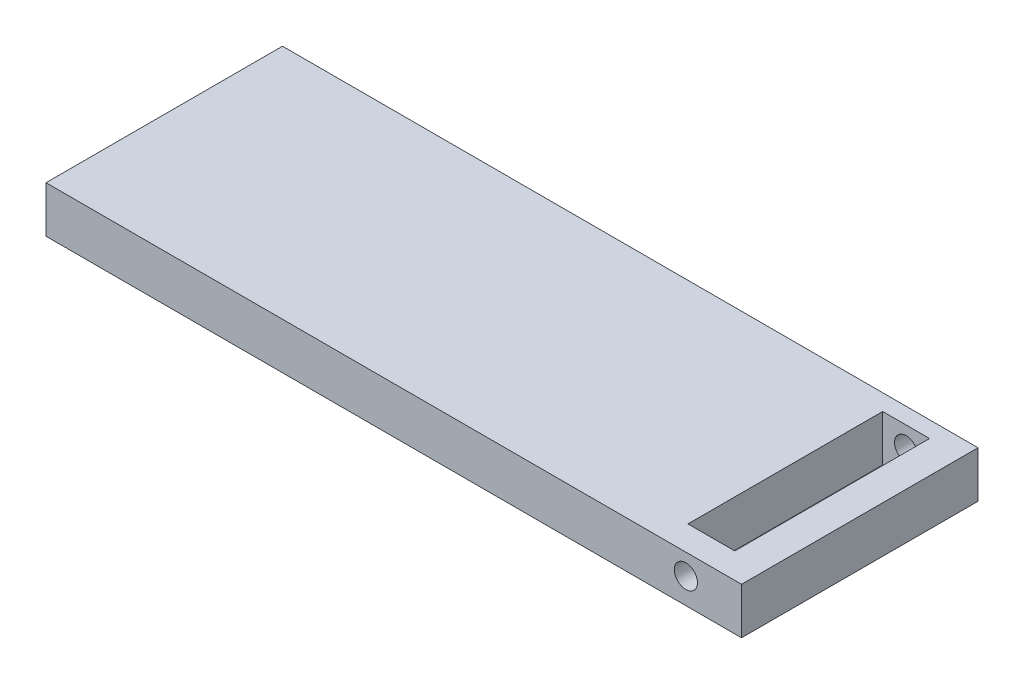
ISO-10303-21;
HEADER;
FILE_DESCRIPTION(('STEP AP214'),'2;1');
FILE_NAME('part.step','',(''),(''),'','','');
FILE_SCHEMA(('AUTOMOTIVE_DESIGN { 1 0 10303 214 1 1 1 1 }'));
ENDSEC;
DATA;
#1=APPLICATION_CONTEXT('core data for automotive mechanical design processes');
#2=APPLICATION_PROTOCOL_DEFINITION('international standard','automotive_design',2000,#1);
#3=PRODUCT_CONTEXT('',#1,'mechanical');
#4=PRODUCT('Part','Part','',(#3));
#5=PRODUCT_RELATED_PRODUCT_CATEGORY('part','',(#4));
#6=PRODUCT_DEFINITION_FORMATION('','',#4);
#7=PRODUCT_DEFINITION_CONTEXT('part definition',#1,'design');
#8=PRODUCT_DEFINITION('design','',#6,#7);
#9=PRODUCT_DEFINITION_SHAPE('','',#8);
#10=(LENGTH_UNIT() NAMED_UNIT(*) SI_UNIT(.MILLI.,.METRE.));
#11=(NAMED_UNIT(*) PLANE_ANGLE_UNIT() SI_UNIT($,.RADIAN.));
#12=(NAMED_UNIT(*) SI_UNIT($,.STERADIAN.) SOLID_ANGLE_UNIT());
#13=UNCERTAINTY_MEASURE_WITH_UNIT(LENGTH_MEASURE(1.E-05),#10,'distance_accuracy_value','');
#14=(GEOMETRIC_REPRESENTATION_CONTEXT(3) GLOBAL_UNCERTAINTY_ASSIGNED_CONTEXT((#13)) GLOBAL_UNIT_ASSIGNED_CONTEXT((#10,
#11,#12)) REPRESENTATION_CONTEXT('',''));
#15=CARTESIAN_POINT('',(0.,0.,0.));
#16=DIRECTION('',(0.,0.,1.));
#17=DIRECTION('',(1.,0.,0.));
#18=AXIS2_PLACEMENT_3D('',#15,#16,#17);
#19=CARTESIAN_POINT('',(75.,10.,25.5));
#20=DIRECTION('',(-1.,0.,0.));
#21=DIRECTION('',(0.,0.,1.));
#22=AXIS2_PLACEMENT_3D('',#19,#20,#21);
#23=PLANE('',#22);
#24=DIRECTION('',(0.,0.,-1.));
#25=VECTOR('',#24,1.);
#26=CARTESIAN_POINT('',(75.,0.,25.5));
#27=LINE('',#26,#25);
#28=CARTESIAN_POINT('',(75.,0.,25.5));
#29=VERTEX_POINT('',#28);
#30=CARTESIAN_POINT('',(75.,0.,-25.5));
#31=VERTEX_POINT('',#30);
#32=EDGE_CURVE('E136',#29,#31,#27,.T.);
#33=ORIENTED_EDGE('',*,*,#32,.T.);
#34=DIRECTION('',(0.,-1.,0.));
#35=VECTOR('',#34,1.);
#36=CARTESIAN_POINT('',(75.,10.,-25.5));
#37=LINE('',#36,#35);
#38=CARTESIAN_POINT('',(75.,10.,-25.5));
#39=VERTEX_POINT('',#38);
#40=EDGE_CURVE('E11',#39,#31,#37,.T.);
#41=ORIENTED_EDGE('',*,*,#40,.F.);
#42=DIRECTION('',(0.,0.,-1.));
#43=VECTOR('',#42,1.);
#44=CARTESIAN_POINT('',(75.,10.,25.5));
#45=LINE('',#44,#43);
#46=CARTESIAN_POINT('',(75.,10.,25.5));
#47=VERTEX_POINT('',#46);
#48=EDGE_CURVE('E140',#47,#39,#45,.T.);
#49=ORIENTED_EDGE('',*,*,#48,.F.);
#50=DIRECTION('',(0.,-1.,0.));
#51=VECTOR('',#50,1.);
#52=CARTESIAN_POINT('',(75.,10.,25.5));
#53=LINE('',#52,#51);
#54=EDGE_CURVE('E150',#47,#29,#53,.T.);
#55=ORIENTED_EDGE('',*,*,#54,.T.);
#56=EDGE_LOOP('',(#33,#41,#49,#55));
#57=FACE_BOUND('',#56,.T.);
#58=ADVANCED_FACE('F35',(#57),#23,.F.);
#59=CARTESIAN_POINT('',(-75.,10.,-25.5));
#60=DIRECTION('',(0.,0.,1.));
#61=DIRECTION('',(1.,0.,0.));
#62=AXIS2_PLACEMENT_3D('',#59,#60,#61);
#63=PLANE('',#62);
#64=CARTESIAN_POINT('',(63.,5.51556153898147,-25.5));
#65=DIRECTION('',(0.,0.,1.));
#66=DIRECTION('',(1.,0.,0.));
#67=AXIS2_PLACEMENT_3D('',#64,#65,#66);
#68=CIRCLE('',#67,2.5);
#69=CARTESIAN_POINT('',(65.5,5.51556153898147,-25.5));
#70=VERTEX_POINT('',#69);
#71=EDGE_CURVE('E227',#70,#70,#68,.T.);
#72=ORIENTED_EDGE('',*,*,#71,.T.);
#73=EDGE_LOOP('',(#72));
#74=FACE_BOUND('',#73,.T.);
#75=DIRECTION('',(-1.,0.,0.));
#76=VECTOR('',#75,1.);
#77=CARTESIAN_POINT('',(-75.,0.,-25.5));
#78=LINE('',#77,#76);
#79=CARTESIAN_POINT('',(-75.,0.,-25.5));
#80=VERTEX_POINT('',#79);
#81=EDGE_CURVE('E153',#31,#80,#78,.T.);
#82=ORIENTED_EDGE('',*,*,#81,.T.);
#83=DIRECTION('',(0.,-1.,0.));
#84=VECTOR('',#83,1.);
#85=CARTESIAN_POINT('',(-75.,10.,-25.5));
#86=LINE('',#85,#84);
#87=CARTESIAN_POINT('',(-75.,10.,-25.5));
#88=VERTEX_POINT('',#87);
#89=EDGE_CURVE('E43',#88,#80,#86,.T.);
#90=ORIENTED_EDGE('',*,*,#89,.F.);
#91=DIRECTION('',(-1.,0.,0.));
#92=VECTOR('',#91,1.);
#93=CARTESIAN_POINT('',(-75.,10.,-25.5));
#94=LINE('',#93,#92);
#95=EDGE_CURVE('E143',#39,#88,#94,.T.);
#96=ORIENTED_EDGE('',*,*,#95,.F.);
#97=ORIENTED_EDGE('',*,*,#40,.T.);
#98=EDGE_LOOP('',(#82,#90,#96,#97));
#99=FACE_BOUND('',#98,.T.);
#100=ADVANCED_FACE('F182',(#74,#99),#63,.F.);
#101=CARTESIAN_POINT('',(-75.,10.,25.5));
#102=DIRECTION('',(1.,0.,0.));
#103=DIRECTION('',(0.,0.,-1.));
#104=AXIS2_PLACEMENT_3D('',#101,#102,#103);
#105=PLANE('',#104);
#106=DIRECTION('',(0.,0.,1.));
#107=VECTOR('',#106,1.);
#108=CARTESIAN_POINT('',(-75.,0.,25.5));
#109=LINE('',#108,#107);
#110=CARTESIAN_POINT('',(-75.,0.,25.5));
#111=VERTEX_POINT('',#110);
#112=EDGE_CURVE('E155',#80,#111,#109,.T.);
#113=ORIENTED_EDGE('',*,*,#112,.T.);
#114=DIRECTION('',(0.,-1.,0.));
#115=VECTOR('',#114,1.);
#116=CARTESIAN_POINT('',(-75.,10.,25.5));
#117=LINE('',#116,#115);
#118=CARTESIAN_POINT('',(-75.,10.,25.5));
#119=VERTEX_POINT('',#118);
#120=EDGE_CURVE('E160',#119,#111,#117,.T.);
#121=ORIENTED_EDGE('',*,*,#120,.F.);
#122=DIRECTION('',(0.,0.,1.));
#123=VECTOR('',#122,1.);
#124=CARTESIAN_POINT('',(-75.,10.,25.5));
#125=LINE('',#124,#123);
#126=EDGE_CURVE('E146',#88,#119,#125,.T.);
#127=ORIENTED_EDGE('',*,*,#126,.F.);
#128=ORIENTED_EDGE('',*,*,#89,.T.);
#129=EDGE_LOOP('',(#113,#121,#127,#128));
#130=FACE_BOUND('',#129,.T.);
#131=ADVANCED_FACE('F168',(#130),#105,.F.);
#132=CARTESIAN_POINT('',(-75.,10.,25.5));
#133=DIRECTION('',(0.,0.,-1.));
#134=DIRECTION('',(-1.,0.,0.));
#135=AXIS2_PLACEMENT_3D('',#132,#133,#134);
#136=PLANE('',#135);
#137=CARTESIAN_POINT('',(63.,5.51556153898147,25.5));
#138=DIRECTION('',(0.,0.,1.));
#139=DIRECTION('',(1.,0.,0.));
#140=AXIS2_PLACEMENT_3D('',#137,#138,#139);
#141=CIRCLE('',#140,2.5);
#142=CARTESIAN_POINT('',(65.5,5.51556153898147,25.5));
#143=VERTEX_POINT('',#142);
#144=EDGE_CURVE('E223',#143,#143,#141,.T.);
#145=ORIENTED_EDGE('',*,*,#144,.F.);
#146=EDGE_LOOP('',(#145));
#147=FACE_BOUND('',#146,.T.);
#148=DIRECTION('',(1.,0.,0.));
#149=VECTOR('',#148,1.);
#150=CARTESIAN_POINT('',(-75.,0.,25.5));
#151=LINE('',#150,#149);
#152=EDGE_CURVE('E144',#111,#29,#151,.T.);
#153=ORIENTED_EDGE('',*,*,#152,.T.);
#154=ORIENTED_EDGE('',*,*,#54,.F.);
#155=DIRECTION('',(1.,0.,0.));
#156=VECTOR('',#155,1.);
#157=CARTESIAN_POINT('',(-75.,10.,25.5));
#158=LINE('',#157,#156);
#159=EDGE_CURVE('E148',#119,#47,#158,.T.);
#160=ORIENTED_EDGE('',*,*,#159,.F.);
#161=ORIENTED_EDGE('',*,*,#120,.T.);
#162=EDGE_LOOP('',(#153,#154,#160,#161));
#163=FACE_BOUND('',#162,.T.);
#164=ADVANCED_FACE('F175',(#147,#163),#136,.F.);
#165=CARTESIAN_POINT('',(0.,10.,0.));
#166=DIRECTION('',(0.,-1.,0.));
#167=DIRECTION('',(0.,0.,-1.));
#168=AXIS2_PLACEMENT_3D('',#165,#166,#167);
#169=PLANE('',#168);
#170=DIRECTION('',(-1.,0.,0.));
#171=VECTOR('',#170,1.);
#172=CARTESIAN_POINT('',(57.95,10.,-22.));
#173=LINE('',#172,#171);
#174=CARTESIAN_POINT('',(68.05,10.,-22.));
#175=VERTEX_POINT('',#174);
#176=CARTESIAN_POINT('',(57.95,10.,-22.));
#177=VERTEX_POINT('',#176);
#178=EDGE_CURVE('E130',#175,#177,#173,.T.);
#179=ORIENTED_EDGE('',*,*,#178,.F.);
#180=DIRECTION('',(0.,0.,-1.));
#181=VECTOR('',#180,1.);
#182=CARTESIAN_POINT('',(68.05,10.,20.));
#183=LINE('',#182,#181);
#184=CARTESIAN_POINT('',(68.05,10.,20.));
#185=VERTEX_POINT('',#184);
#186=EDGE_CURVE('E50',#185,#175,#183,.T.);
#187=ORIENTED_EDGE('',*,*,#186,.F.);
#188=DIRECTION('',(1.,0.,0.));
#189=VECTOR('',#188,1.);
#190=CARTESIAN_POINT('',(57.95,10.,20.));
#191=LINE('',#190,#189);
#192=CARTESIAN_POINT('',(57.95,10.,20.));
#193=VERTEX_POINT('',#192);
#194=EDGE_CURVE('E118',#193,#185,#191,.T.);
#195=ORIENTED_EDGE('',*,*,#194,.F.);
#196=DIRECTION('',(0.,0.,1.));
#197=VECTOR('',#196,1.);
#198=CARTESIAN_POINT('',(57.95,10.,20.));
#199=LINE('',#198,#197);
#200=EDGE_CURVE('E121',#177,#193,#199,.T.);
#201=ORIENTED_EDGE('',*,*,#200,.F.);
#202=EDGE_LOOP('',(#179,#187,#195,#201));
#203=FACE_BOUND('',#202,.T.);
#204=ORIENTED_EDGE('',*,*,#48,.T.);
#205=ORIENTED_EDGE('',*,*,#95,.T.);
#206=ORIENTED_EDGE('',*,*,#126,.T.);
#207=ORIENTED_EDGE('',*,*,#159,.T.);
#208=EDGE_LOOP('',(#204,#205,#206,#207));
#209=FACE_BOUND('',#208,.T.);
#210=ADVANCED_FACE('F181',(#203,#209),#169,.F.);
#211=CARTESIAN_POINT('',(0.,0.,0.));
#212=DIRECTION('',(0.,-1.,0.));
#213=DIRECTION('',(0.,0.,-1.));
#214=AXIS2_PLACEMENT_3D('',#211,#212,#213);
#215=PLANE('',#214);
#216=DIRECTION('',(0.,0.,-1.));
#217=VECTOR('',#216,1.);
#218=CARTESIAN_POINT('',(68.05,0.,20.));
#219=LINE('',#218,#217);
#220=CARTESIAN_POINT('',(68.05,0.,20.));
#221=VERTEX_POINT('',#220);
#222=CARTESIAN_POINT('',(68.05,0.,-22.));
#223=VERTEX_POINT('',#222);
#224=EDGE_CURVE('E102',#221,#223,#219,.T.);
#225=ORIENTED_EDGE('',*,*,#224,.T.);
#226=DIRECTION('',(-1.,0.,0.));
#227=VECTOR('',#226,1.);
#228=CARTESIAN_POINT('',(57.95,0.,-22.));
#229=LINE('',#228,#227);
#230=CARTESIAN_POINT('',(57.95,0.,-22.));
#231=VERTEX_POINT('',#230);
#232=EDGE_CURVE('E111',#223,#231,#229,.T.);
#233=ORIENTED_EDGE('',*,*,#232,.T.);
#234=DIRECTION('',(0.,0.,1.));
#235=VECTOR('',#234,1.);
#236=CARTESIAN_POINT('',(57.95,0.,20.));
#237=LINE('',#236,#235);
#238=CARTESIAN_POINT('',(57.95,0.,20.));
#239=VERTEX_POINT('',#238);
#240=EDGE_CURVE('E58',#231,#239,#237,.T.);
#241=ORIENTED_EDGE('',*,*,#240,.T.);
#242=DIRECTION('',(1.,0.,0.));
#243=VECTOR('',#242,1.);
#244=CARTESIAN_POINT('',(57.95,0.,20.));
#245=LINE('',#244,#243);
#246=EDGE_CURVE('E108',#239,#221,#245,.T.);
#247=ORIENTED_EDGE('',*,*,#246,.T.);
#248=EDGE_LOOP('',(#225,#233,#241,#247));
#249=FACE_BOUND('',#248,.T.);
#250=ORIENTED_EDGE('',*,*,#32,.F.);
#251=ORIENTED_EDGE('',*,*,#152,.F.);
#252=ORIENTED_EDGE('',*,*,#112,.F.);
#253=ORIENTED_EDGE('',*,*,#81,.F.);
#254=EDGE_LOOP('',(#250,#251,#252,#253));
#255=FACE_BOUND('',#254,.T.);
#256=ADVANCED_FACE('F115',(#249,#255),#215,.T.);
#257=CARTESIAN_POINT('',(68.05,0.,20.));
#258=DIRECTION('',(1.,0.,0.));
#259=DIRECTION('',(0.,0.,-1.));
#260=AXIS2_PLACEMENT_3D('',#257,#258,#259);
#261=PLANE('',#260);
#262=ORIENTED_EDGE('',*,*,#186,.T.);
#263=DIRECTION('',(0.,1.,0.));
#264=VECTOR('',#263,1.);
#265=CARTESIAN_POINT('',(68.05,0.,-22.));
#266=LINE('',#265,#264);
#267=EDGE_CURVE('E98',#223,#175,#266,.T.);
#268=ORIENTED_EDGE('',*,*,#267,.F.);
#269=ORIENTED_EDGE('',*,*,#224,.F.);
#270=DIRECTION('',(0.,1.,0.));
#271=VECTOR('',#270,1.);
#272=CARTESIAN_POINT('',(68.05,0.,20.));
#273=LINE('',#272,#271);
#274=EDGE_CURVE('E134',#221,#185,#273,.T.);
#275=ORIENTED_EDGE('',*,*,#274,.T.);
#276=EDGE_LOOP('',(#262,#268,#269,#275));
#277=FACE_BOUND('',#276,.T.);
#278=ADVANCED_FACE('F100',(#277),#261,.F.);
#279=CARTESIAN_POINT('',(57.95,0.,20.));
#280=DIRECTION('',(0.,0.,1.));
#281=DIRECTION('',(1.,0.,0.));
#282=AXIS2_PLACEMENT_3D('',#279,#280,#281);
#283=PLANE('',#282);
#284=CARTESIAN_POINT('',(63.,5.51556153898147,20.));
#285=DIRECTION('',(0.,0.,1.));
#286=DIRECTION('',(1.,0.,0.));
#287=AXIS2_PLACEMENT_3D('',#284,#285,#286);
#288=CIRCLE('',#287,2.5);
#289=CARTESIAN_POINT('',(65.5,5.51556153898147,20.));
#290=VERTEX_POINT('',#289);
#291=EDGE_CURVE('E124',#290,#290,#288,.T.);
#292=ORIENTED_EDGE('',*,*,#291,.T.);
#293=EDGE_LOOP('',(#292));
#294=FACE_BOUND('',#293,.T.);
#295=ORIENTED_EDGE('',*,*,#194,.T.);
#296=ORIENTED_EDGE('',*,*,#274,.F.);
#297=ORIENTED_EDGE('',*,*,#246,.F.);
#298=DIRECTION('',(0.,1.,0.));
#299=VECTOR('',#298,1.);
#300=CARTESIAN_POINT('',(57.95,0.,20.));
#301=LINE('',#300,#299);
#302=EDGE_CURVE('E137',#239,#193,#301,.T.);
#303=ORIENTED_EDGE('',*,*,#302,.T.);
#304=EDGE_LOOP('',(#295,#296,#297,#303));
#305=FACE_BOUND('',#304,.T.);
#306=ADVANCED_FACE('F202',(#294,#305),#283,.F.);
#307=CARTESIAN_POINT('',(57.95,0.,20.));
#308=DIRECTION('',(-1.,0.,0.));
#309=DIRECTION('',(0.,0.,1.));
#310=AXIS2_PLACEMENT_3D('',#307,#308,#309);
#311=PLANE('',#310);
#312=ORIENTED_EDGE('',*,*,#200,.T.);
#313=ORIENTED_EDGE('',*,*,#302,.F.);
#314=ORIENTED_EDGE('',*,*,#240,.F.);
#315=DIRECTION('',(0.,1.,0.));
#316=VECTOR('',#315,1.);
#317=CARTESIAN_POINT('',(57.95,0.,-22.));
#318=LINE('',#317,#316);
#319=EDGE_CURVE('E107',#231,#177,#318,.T.);
#320=ORIENTED_EDGE('',*,*,#319,.T.);
#321=EDGE_LOOP('',(#312,#313,#314,#320));
#322=FACE_BOUND('',#321,.T.);
#323=ADVANCED_FACE('F206',(#322),#311,.F.);
#324=CARTESIAN_POINT('',(57.95,0.,-22.));
#325=DIRECTION('',(0.,0.,-1.));
#326=DIRECTION('',(-1.,0.,0.));
#327=AXIS2_PLACEMENT_3D('',#324,#325,#326);
#328=PLANE('',#327);
#329=CARTESIAN_POINT('',(63.,5.51556153898147,-22.));
#330=DIRECTION('',(0.,0.,-1.));
#331=DIRECTION('',(-1.,0.,0.));
#332=AXIS2_PLACEMENT_3D('',#329,#330,#331);
#333=CIRCLE('',#332,2.5);
#334=CARTESIAN_POINT('',(60.5,5.51556153898147,-22.));
#335=VERTEX_POINT('',#334);
#336=EDGE_CURVE('E38',#335,#335,#333,.T.);
#337=ORIENTED_EDGE('',*,*,#336,.T.);
#338=EDGE_LOOP('',(#337));
#339=FACE_BOUND('',#338,.T.);
#340=ORIENTED_EDGE('',*,*,#178,.T.);
#341=ORIENTED_EDGE('',*,*,#319,.F.);
#342=ORIENTED_EDGE('',*,*,#232,.F.);
#343=ORIENTED_EDGE('',*,*,#267,.T.);
#344=EDGE_LOOP('',(#340,#341,#342,#343));
#345=FACE_BOUND('',#344,.T.);
#346=ADVANCED_FACE('F112',(#339,#345),#328,.F.);
#347=CARTESIAN_POINT('',(63.,5.51556153898147,-25.5));
#348=DIRECTION('',(0.,0.,1.));
#349=DIRECTION('',(1.,0.,0.));
#350=AXIS2_PLACEMENT_3D('',#347,#348,#349);
#351=CYLINDRICAL_SURFACE('',#350,2.5);
#352=ORIENTED_EDGE('',*,*,#71,.F.);
#353=EDGE_LOOP('',(#352));
#354=FACE_BOUND('',#353,.T.);
#355=ORIENTED_EDGE('',*,*,#336,.F.);
#356=EDGE_LOOP('',(#355));
#357=FACE_BOUND('',#356,.T.);
#358=ADVANCED_FACE('F205',(#354,#357),#351,.F.);
#359=ORIENTED_EDGE('',*,*,#144,.T.);
#360=EDGE_LOOP('',(#359));
#361=FACE_BOUND('',#360,.T.);
#362=ORIENTED_EDGE('',*,*,#291,.F.);
#363=EDGE_LOOP('',(#362));
#364=FACE_BOUND('',#363,.T.);
#365=ADVANCED_FACE('F213',(#361,#364),#351,.F.);
#366=CLOSED_SHELL('',(#58,#100,#131,#164,#210,#256,#278,#306,#323,#346,#358,#365));
#367=MANIFOLD_SOLID_BREP('B2',#366);
#368=ADVANCED_BREP_SHAPE_REPRESENTATION('',(#18,#367),#14);
#369=SHAPE_DEFINITION_REPRESENTATION(#9,#368);
ENDSEC;
END-ISO-10303-21;
